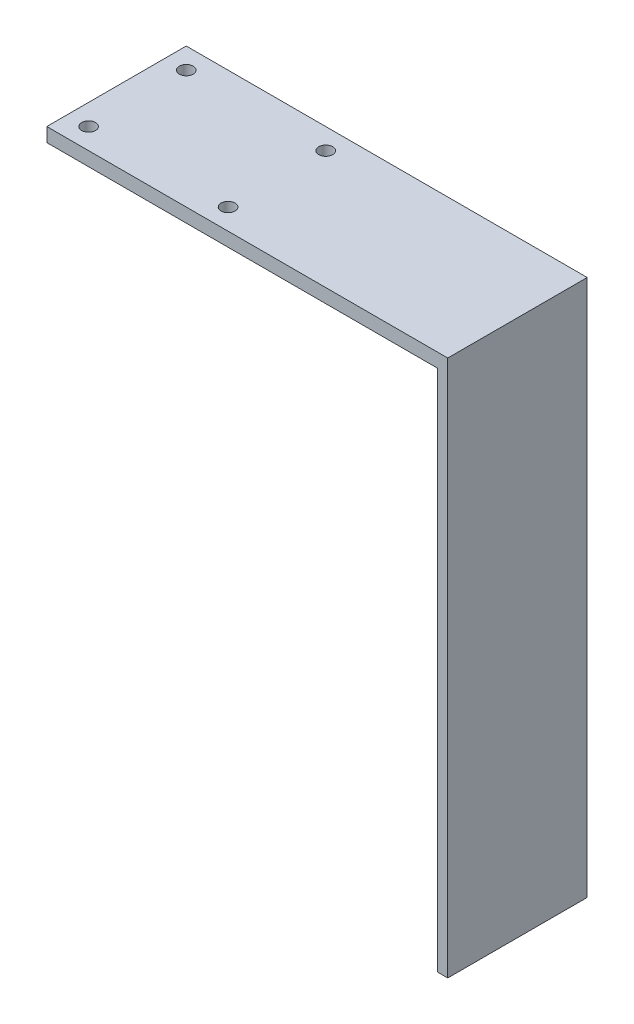
ISO-10303-21;
HEADER;
FILE_DESCRIPTION(('STEP AP214'),'2;1');
FILE_NAME('part.step','',(''),(''),'','','');
FILE_SCHEMA(('AUTOMOTIVE_DESIGN { 1 0 10303 214 1 1 1 1 }'));
ENDSEC;
DATA;
#1=APPLICATION_CONTEXT('core data for automotive mechanical design processes');
#2=APPLICATION_PROTOCOL_DEFINITION('international standard','automotive_design',2000,#1);
#3=PRODUCT_CONTEXT('',#1,'mechanical');
#4=PRODUCT('Part','Part','',(#3));
#5=PRODUCT_RELATED_PRODUCT_CATEGORY('part','',(#4));
#6=PRODUCT_DEFINITION_FORMATION('','',#4);
#7=PRODUCT_DEFINITION_CONTEXT('part definition',#1,'design');
#8=PRODUCT_DEFINITION('design','',#6,#7);
#9=PRODUCT_DEFINITION_SHAPE('','',#8);
#10=(LENGTH_UNIT() NAMED_UNIT(*) SI_UNIT(.MILLI.,.METRE.));
#11=(NAMED_UNIT(*) PLANE_ANGLE_UNIT() SI_UNIT($,.RADIAN.));
#12=(NAMED_UNIT(*) SI_UNIT($,.STERADIAN.) SOLID_ANGLE_UNIT());
#13=UNCERTAINTY_MEASURE_WITH_UNIT(LENGTH_MEASURE(1.E-05),#10,'distance_accuracy_value','');
#14=(GEOMETRIC_REPRESENTATION_CONTEXT(3) GLOBAL_UNCERTAINTY_ASSIGNED_CONTEXT((#13)) GLOBAL_UNIT_ASSIGNED_CONTEXT((#10,
#11,#12)) REPRESENTATION_CONTEXT('',''));
#15=CARTESIAN_POINT('',(0.,0.,0.));
#16=DIRECTION('',(0.,0.,1.));
#17=DIRECTION('',(1.,0.,0.));
#18=AXIS2_PLACEMENT_3D('',#15,#16,#17);
#19=CARTESIAN_POINT('',(0.,0.,0.));
#20=DIRECTION('',(0.,1.,0.));
#21=DIRECTION('',(0.,0.,1.));
#22=AXIS2_PLACEMENT_3D('',#19,#20,#21);
#23=PLANE('',#22);
#24=CARTESIAN_POINT('',(-51.5,0.,-14.));
#25=DIRECTION('',(0.,1.,0.));
#26=DIRECTION('',(0.,0.,1.));
#27=AXIS2_PLACEMENT_3D('',#24,#25,#26);
#28=CIRCLE('',#27,2.);
#29=CARTESIAN_POINT('',(-51.5,0.,-12.));
#30=VERTEX_POINT('',#29);
#31=EDGE_CURVE('E127',#30,#30,#28,.T.);
#32=ORIENTED_EDGE('',*,*,#31,.T.);
#33=EDGE_LOOP('',(#32));
#34=FACE_BOUND('',#33,.T.);
#35=CARTESIAN_POINT('',(-11.5,0.,14.));
#36=DIRECTION('',(0.,1.,0.));
#37=DIRECTION('',(0.,0.,1.));
#38=AXIS2_PLACEMENT_3D('',#35,#36,#37);
#39=CIRCLE('',#38,2.);
#40=CARTESIAN_POINT('',(-11.5,0.,16.));
#41=VERTEX_POINT('',#40);
#42=EDGE_CURVE('E131',#41,#41,#39,.T.);
#43=ORIENTED_EDGE('',*,*,#42,.T.);
#44=EDGE_LOOP('',(#43));
#45=FACE_BOUND('',#44,.T.);
#46=CARTESIAN_POINT('',(-51.5,0.,14.));
#47=DIRECTION('',(0.,1.,0.));
#48=DIRECTION('',(0.,0.,1.));
#49=AXIS2_PLACEMENT_3D('',#46,#47,#48);
#50=CIRCLE('',#49,2.);
#51=CARTESIAN_POINT('',(-51.5,0.,16.));
#52=VERTEX_POINT('',#51);
#53=EDGE_CURVE('E137',#52,#52,#50,.T.);
#54=ORIENTED_EDGE('',*,*,#53,.T.);
#55=EDGE_LOOP('',(#54));
#56=FACE_BOUND('',#55,.T.);
#57=CARTESIAN_POINT('',(-11.5,0.,-14.));
#58=DIRECTION('',(0.,1.,0.));
#59=DIRECTION('',(0.,0.,1.));
#60=AXIS2_PLACEMENT_3D('',#57,#58,#59);
#61=CIRCLE('',#60,2.);
#62=CARTESIAN_POINT('',(-11.5,0.,-12.));
#63=VERTEX_POINT('',#62);
#64=EDGE_CURVE('E143',#63,#63,#61,.T.);
#65=ORIENTED_EDGE('',*,*,#64,.T.);
#66=EDGE_LOOP('',(#65));
#67=FACE_BOUND('',#66,.T.);
#68=DIRECTION('',(0.,0.,-1.));
#69=VECTOR('',#68,1.);
#70=CARTESIAN_POINT('',(54.5,0.,20.));
#71=LINE('',#70,#69);
#72=CARTESIAN_POINT('',(54.5,0.,20.));
#73=VERTEX_POINT('',#72);
#74=CARTESIAN_POINT('',(54.5,0.,-20.));
#75=VERTEX_POINT('',#74);
#76=EDGE_CURVE('E48',#73,#75,#71,.T.);
#77=ORIENTED_EDGE('',*,*,#76,.F.);
#78=DIRECTION('',(1.,0.,0.));
#79=VECTOR('',#78,1.);
#80=CARTESIAN_POINT('',(-57.5,0.,20.));
#81=LINE('',#80,#79);
#82=CARTESIAN_POINT('',(-57.5,0.,20.));
#83=VERTEX_POINT('',#82);
#84=EDGE_CURVE('E153',#83,#73,#81,.T.);
#85=ORIENTED_EDGE('',*,*,#84,.F.);
#86=DIRECTION('',(0.,0.,1.));
#87=VECTOR('',#86,1.);
#88=CARTESIAN_POINT('',(-57.5,0.,-20.));
#89=LINE('',#88,#87);
#90=CARTESIAN_POINT('',(-57.5,0.,-20.));
#91=VERTEX_POINT('',#90);
#92=EDGE_CURVE('E73',#91,#83,#89,.T.);
#93=ORIENTED_EDGE('',*,*,#92,.F.);
#94=DIRECTION('',(-1.,0.,0.));
#95=VECTOR('',#94,1.);
#96=CARTESIAN_POINT('',(-57.5,0.,-20.));
#97=LINE('',#96,#95);
#98=EDGE_CURVE('E149',#75,#91,#97,.T.);
#99=ORIENTED_EDGE('',*,*,#98,.F.);
#100=EDGE_LOOP('',(#77,#85,#93,#99));
#101=FACE_BOUND('',#100,.T.);
#102=ADVANCED_FACE('F33',(#34,#45,#56,#67,#101),#23,.F.);
#103=CARTESIAN_POINT('',(0.,4.,0.));
#104=DIRECTION('',(0.,1.,0.));
#105=DIRECTION('',(0.,0.,1.));
#106=AXIS2_PLACEMENT_3D('',#103,#104,#105);
#107=PLANE('',#106);
#108=CARTESIAN_POINT('',(-11.5,4.,14.));
#109=DIRECTION('',(0.,1.,0.));
#110=DIRECTION('',(0.,0.,1.));
#111=AXIS2_PLACEMENT_3D('',#108,#109,#110);
#112=CIRCLE('',#111,2.);
#113=CARTESIAN_POINT('',(-11.5,4.,16.));
#114=VERTEX_POINT('',#113);
#115=EDGE_CURVE('E134',#114,#114,#112,.T.);
#116=ORIENTED_EDGE('',*,*,#115,.F.);
#117=EDGE_LOOP('',(#116));
#118=FACE_BOUND('',#117,.T.);
#119=CARTESIAN_POINT('',(-11.5,4.,-14.));
#120=DIRECTION('',(0.,1.,0.));
#121=DIRECTION('',(0.,0.,1.));
#122=AXIS2_PLACEMENT_3D('',#119,#120,#121);
#123=CIRCLE('',#122,2.);
#124=CARTESIAN_POINT('',(-11.5,4.,-12.));
#125=VERTEX_POINT('',#124);
#126=EDGE_CURVE('E146',#125,#125,#123,.T.);
#127=ORIENTED_EDGE('',*,*,#126,.F.);
#128=EDGE_LOOP('',(#127));
#129=FACE_BOUND('',#128,.T.);
#130=DIRECTION('',(0.,0.,-1.));
#131=VECTOR('',#130,1.);
#132=CARTESIAN_POINT('',(57.5,4.,-20.));
#133=LINE('',#132,#131);
#134=CARTESIAN_POINT('',(57.5,4.,20.));
#135=VERTEX_POINT('',#134);
#136=CARTESIAN_POINT('',(57.5,4.,-20.));
#137=VERTEX_POINT('',#136);
#138=EDGE_CURVE('E101',#135,#137,#133,.T.);
#139=ORIENTED_EDGE('',*,*,#138,.T.);
#140=DIRECTION('',(-1.,0.,0.));
#141=VECTOR('',#140,1.);
#142=CARTESIAN_POINT('',(-57.5,4.,-20.));
#143=LINE('',#142,#141);
#144=CARTESIAN_POINT('',(-57.5,4.,-20.));
#145=VERTEX_POINT('',#144);
#146=EDGE_CURVE('E80',#137,#145,#143,.T.);
#147=ORIENTED_EDGE('',*,*,#146,.T.);
#148=DIRECTION('',(0.,0.,1.));
#149=VECTOR('',#148,1.);
#150=CARTESIAN_POINT('',(-57.5,4.,-20.));
#151=LINE('',#150,#149);
#152=CARTESIAN_POINT('',(-57.5,4.,20.));
#153=VERTEX_POINT('',#152);
#154=EDGE_CURVE('E155',#145,#153,#151,.T.);
#155=ORIENTED_EDGE('',*,*,#154,.T.);
#156=DIRECTION('',(1.,0.,0.));
#157=VECTOR('',#156,1.);
#158=CARTESIAN_POINT('',(-57.5,4.,20.));
#159=LINE('',#158,#157);
#160=EDGE_CURVE('E57',#153,#135,#159,.T.);
#161=ORIENTED_EDGE('',*,*,#160,.T.);
#162=EDGE_LOOP('',(#139,#147,#155,#161));
#163=FACE_BOUND('',#162,.T.);
#164=CARTESIAN_POINT('',(-51.5,4.,14.));
#165=DIRECTION('',(0.,1.,0.));
#166=DIRECTION('',(0.,0.,1.));
#167=AXIS2_PLACEMENT_3D('',#164,#165,#166);
#168=CIRCLE('',#167,2.);
#169=CARTESIAN_POINT('',(-51.5,4.,16.));
#170=VERTEX_POINT('',#169);
#171=EDGE_CURVE('E140',#170,#170,#168,.T.);
#172=ORIENTED_EDGE('',*,*,#171,.F.);
#173=EDGE_LOOP('',(#172));
#174=FACE_BOUND('',#173,.T.);
#175=CARTESIAN_POINT('',(-51.5,4.,-14.));
#176=DIRECTION('',(0.,1.,0.));
#177=DIRECTION('',(0.,0.,1.));
#178=AXIS2_PLACEMENT_3D('',#175,#176,#177);
#179=CIRCLE('',#178,2.);
#180=CARTESIAN_POINT('',(-51.5,4.,-12.));
#181=VERTEX_POINT('',#180);
#182=EDGE_CURVE('E128',#181,#181,#179,.T.);
#183=ORIENTED_EDGE('',*,*,#182,.F.);
#184=EDGE_LOOP('',(#183));
#185=FACE_BOUND('',#184,.T.);
#186=ADVANCED_FACE('F173',(#118,#129,#163,#174,#185),#107,.T.);
#187=CARTESIAN_POINT('',(57.5,4.,-20.));
#188=DIRECTION('',(-1.,0.,0.));
#189=DIRECTION('',(0.,0.,1.));
#190=AXIS2_PLACEMENT_3D('',#187,#188,#189);
#191=PLANE('',#190);
#192=DIRECTION('',(0.,-1.,0.));
#193=VECTOR('',#192,1.);
#194=CARTESIAN_POINT('',(57.5,4.,20.));
#195=LINE('',#194,#193);
#196=CARTESIAN_POINT('',(57.5,-150.,20.));
#197=VERTEX_POINT('',#196);
#198=EDGE_CURVE('E96',#135,#197,#195,.T.);
#199=ORIENTED_EDGE('',*,*,#198,.T.);
#200=DIRECTION('',(0.,0.,1.));
#201=VECTOR('',#200,1.);
#202=CARTESIAN_POINT('',(57.5,-150.,20.));
#203=LINE('',#202,#201);
#204=CARTESIAN_POINT('',(57.5,-150.,-20.));
#205=VERTEX_POINT('',#204);
#206=EDGE_CURVE('E100',#205,#197,#203,.T.);
#207=ORIENTED_EDGE('',*,*,#206,.F.);
#208=DIRECTION('',(0.,-1.,0.));
#209=VECTOR('',#208,1.);
#210=CARTESIAN_POINT('',(57.5,4.,-20.));
#211=LINE('',#210,#209);
#212=EDGE_CURVE('E11',#137,#205,#211,.T.);
#213=ORIENTED_EDGE('',*,*,#212,.F.);
#214=ORIENTED_EDGE('',*,*,#138,.F.);
#215=EDGE_LOOP('',(#199,#207,#213,#214));
#216=FACE_BOUND('',#215,.T.);
#217=ADVANCED_FACE('F35',(#216),#191,.F.);
#218=CARTESIAN_POINT('',(-57.5,4.,-20.));
#219=DIRECTION('',(0.,0.,1.));
#220=DIRECTION('',(1.,0.,0.));
#221=AXIS2_PLACEMENT_3D('',#218,#219,#220);
#222=PLANE('',#221);
#223=ORIENTED_EDGE('',*,*,#212,.T.);
#224=DIRECTION('',(1.,0.,0.));
#225=VECTOR('',#224,1.);
#226=CARTESIAN_POINT('',(57.5,-150.,-20.));
#227=LINE('',#226,#225);
#228=CARTESIAN_POINT('',(54.5,-150.,-20.));
#229=VERTEX_POINT('',#228);
#230=EDGE_CURVE('E117',#229,#205,#227,.T.);
#231=ORIENTED_EDGE('',*,*,#230,.F.);
#232=DIRECTION('',(0.,1.,0.));
#233=VECTOR('',#232,1.);
#234=CARTESIAN_POINT('',(54.5,-150.,-20.));
#235=LINE('',#234,#233);
#236=EDGE_CURVE('E122',#229,#75,#235,.T.);
#237=ORIENTED_EDGE('',*,*,#236,.T.);
#238=ORIENTED_EDGE('',*,*,#98,.T.);
#239=DIRECTION('',(0.,-1.,0.));
#240=VECTOR('',#239,1.);
#241=CARTESIAN_POINT('',(-57.5,4.,-20.));
#242=LINE('',#241,#240);
#243=EDGE_CURVE('E41',#145,#91,#242,.T.);
#244=ORIENTED_EDGE('',*,*,#243,.F.);
#245=ORIENTED_EDGE('',*,*,#146,.F.);
#246=EDGE_LOOP('',(#223,#231,#237,#238,#244,#245));
#247=FACE_BOUND('',#246,.T.);
#248=ADVANCED_FACE('F166',(#247),#222,.F.);
#249=CARTESIAN_POINT('',(-57.5,4.,-20.));
#250=DIRECTION('',(1.,0.,0.));
#251=DIRECTION('',(0.,0.,-1.));
#252=AXIS2_PLACEMENT_3D('',#249,#250,#251);
#253=PLANE('',#252);
#254=ORIENTED_EDGE('',*,*,#92,.T.);
#255=DIRECTION('',(0.,-1.,0.));
#256=VECTOR('',#255,1.);
#257=CARTESIAN_POINT('',(-57.5,4.,20.));
#258=LINE('',#257,#256);
#259=EDGE_CURVE('E103',#153,#83,#258,.T.);
#260=ORIENTED_EDGE('',*,*,#259,.F.);
#261=ORIENTED_EDGE('',*,*,#154,.F.);
#262=ORIENTED_EDGE('',*,*,#243,.T.);
#263=EDGE_LOOP('',(#254,#260,#261,#262));
#264=FACE_BOUND('',#263,.T.);
#265=ADVANCED_FACE('F162',(#264),#253,.F.);
#266=CARTESIAN_POINT('',(-57.5,4.,20.));
#267=DIRECTION('',(0.,0.,-1.));
#268=DIRECTION('',(-1.,0.,0.));
#269=AXIS2_PLACEMENT_3D('',#266,#267,#268);
#270=PLANE('',#269);
#271=ORIENTED_EDGE('',*,*,#84,.T.);
#272=DIRECTION('',(0.,1.,0.));
#273=VECTOR('',#272,1.);
#274=CARTESIAN_POINT('',(54.5,-150.,20.));
#275=LINE('',#274,#273);
#276=CARTESIAN_POINT('',(54.5,-150.,20.));
#277=VERTEX_POINT('',#276);
#278=EDGE_CURVE('E109',#277,#73,#275,.T.);
#279=ORIENTED_EDGE('',*,*,#278,.F.);
#280=DIRECTION('',(-1.,0.,0.));
#281=VECTOR('',#280,1.);
#282=CARTESIAN_POINT('',(57.5,-150.,20.));
#283=LINE('',#282,#281);
#284=EDGE_CURVE('E106',#197,#277,#283,.T.);
#285=ORIENTED_EDGE('',*,*,#284,.F.);
#286=ORIENTED_EDGE('',*,*,#198,.F.);
#287=ORIENTED_EDGE('',*,*,#160,.F.);
#288=ORIENTED_EDGE('',*,*,#259,.T.);
#289=EDGE_LOOP('',(#271,#279,#285,#286,#287,#288));
#290=FACE_BOUND('',#289,.T.);
#291=ADVANCED_FACE('F107',(#290),#270,.F.);
#292=CARTESIAN_POINT('',(-11.5,4.,-14.));
#293=DIRECTION('',(0.,-1.,0.));
#294=DIRECTION('',(0.,0.,-1.));
#295=AXIS2_PLACEMENT_3D('',#292,#293,#294);
#296=CYLINDRICAL_SURFACE('',#295,2.);
#297=ORIENTED_EDGE('',*,*,#126,.T.);
#298=EDGE_LOOP('',(#297));
#299=FACE_BOUND('',#298,.T.);
#300=ORIENTED_EDGE('',*,*,#64,.F.);
#301=EDGE_LOOP('',(#300));
#302=FACE_BOUND('',#301,.T.);
#303=ADVANCED_FACE('F186',(#299,#302),#296,.F.);
#304=CARTESIAN_POINT('',(-51.5,4.,14.));
#305=DIRECTION('',(0.,-1.,0.));
#306=DIRECTION('',(0.,0.,-1.));
#307=AXIS2_PLACEMENT_3D('',#304,#305,#306);
#308=CYLINDRICAL_SURFACE('',#307,2.);
#309=ORIENTED_EDGE('',*,*,#171,.T.);
#310=EDGE_LOOP('',(#309));
#311=FACE_BOUND('',#310,.T.);
#312=ORIENTED_EDGE('',*,*,#53,.F.);
#313=EDGE_LOOP('',(#312));
#314=FACE_BOUND('',#313,.T.);
#315=ADVANCED_FACE('F190',(#311,#314),#308,.F.);
#316=CARTESIAN_POINT('',(-11.5,4.,14.));
#317=DIRECTION('',(0.,-1.,0.));
#318=DIRECTION('',(0.,0.,-1.));
#319=AXIS2_PLACEMENT_3D('',#316,#317,#318);
#320=CYLINDRICAL_SURFACE('',#319,2.);
#321=ORIENTED_EDGE('',*,*,#115,.T.);
#322=EDGE_LOOP('',(#321));
#323=FACE_BOUND('',#322,.T.);
#324=ORIENTED_EDGE('',*,*,#42,.F.);
#325=EDGE_LOOP('',(#324));
#326=FACE_BOUND('',#325,.T.);
#327=ADVANCED_FACE('F195',(#323,#326),#320,.F.);
#328=CARTESIAN_POINT('',(-51.5,4.,-14.));
#329=DIRECTION('',(0.,-1.,0.));
#330=DIRECTION('',(0.,0.,-1.));
#331=AXIS2_PLACEMENT_3D('',#328,#329,#330);
#332=CYLINDRICAL_SURFACE('',#331,2.);
#333=ORIENTED_EDGE('',*,*,#182,.T.);
#334=EDGE_LOOP('',(#333));
#335=FACE_BOUND('',#334,.T.);
#336=ORIENTED_EDGE('',*,*,#31,.F.);
#337=EDGE_LOOP('',(#336));
#338=FACE_BOUND('',#337,.T.);
#339=ADVANCED_FACE('F202',(#335,#338),#332,.F.);
#340=CARTESIAN_POINT('',(54.5,-150.,20.));
#341=DIRECTION('',(1.,0.,0.));
#342=DIRECTION('',(0.,0.,-1.));
#343=AXIS2_PLACEMENT_3D('',#340,#341,#342);
#344=PLANE('',#343);
#345=ORIENTED_EDGE('',*,*,#76,.T.);
#346=ORIENTED_EDGE('',*,*,#236,.F.);
#347=DIRECTION('',(0.,0.,-1.));
#348=VECTOR('',#347,1.);
#349=CARTESIAN_POINT('',(54.5,-150.,20.));
#350=LINE('',#349,#348);
#351=EDGE_CURVE('E112',#277,#229,#350,.T.);
#352=ORIENTED_EDGE('',*,*,#351,.F.);
#353=ORIENTED_EDGE('',*,*,#278,.T.);
#354=EDGE_LOOP('',(#345,#346,#352,#353));
#355=FACE_BOUND('',#354,.T.);
#356=ADVANCED_FACE('F164',(#355),#344,.F.);
#357=CARTESIAN_POINT('',(0.,-150.,0.));
#358=DIRECTION('',(0.,1.,0.));
#359=DIRECTION('',(0.,0.,1.));
#360=AXIS2_PLACEMENT_3D('',#357,#358,#359);
#361=PLANE('',#360);
#362=ORIENTED_EDGE('',*,*,#206,.T.);
#363=ORIENTED_EDGE('',*,*,#284,.T.);
#364=ORIENTED_EDGE('',*,*,#351,.T.);
#365=ORIENTED_EDGE('',*,*,#230,.T.);
#366=EDGE_LOOP('',(#362,#363,#364,#365));
#367=FACE_BOUND('',#366,.T.);
#368=ADVANCED_FACE('F115',(#367),#361,.F.);
#369=CLOSED_SHELL('',(#102,#186,#217,#248,#265,#291,#303,#315,#327,#339,#356,#368));
#370=MANIFOLD_SOLID_BREP('B2',#369);
#371=ADVANCED_BREP_SHAPE_REPRESENTATION('',(#18,#370),#14);
#372=SHAPE_DEFINITION_REPRESENTATION(#9,#371);
ENDSEC;
END-ISO-10303-21;
